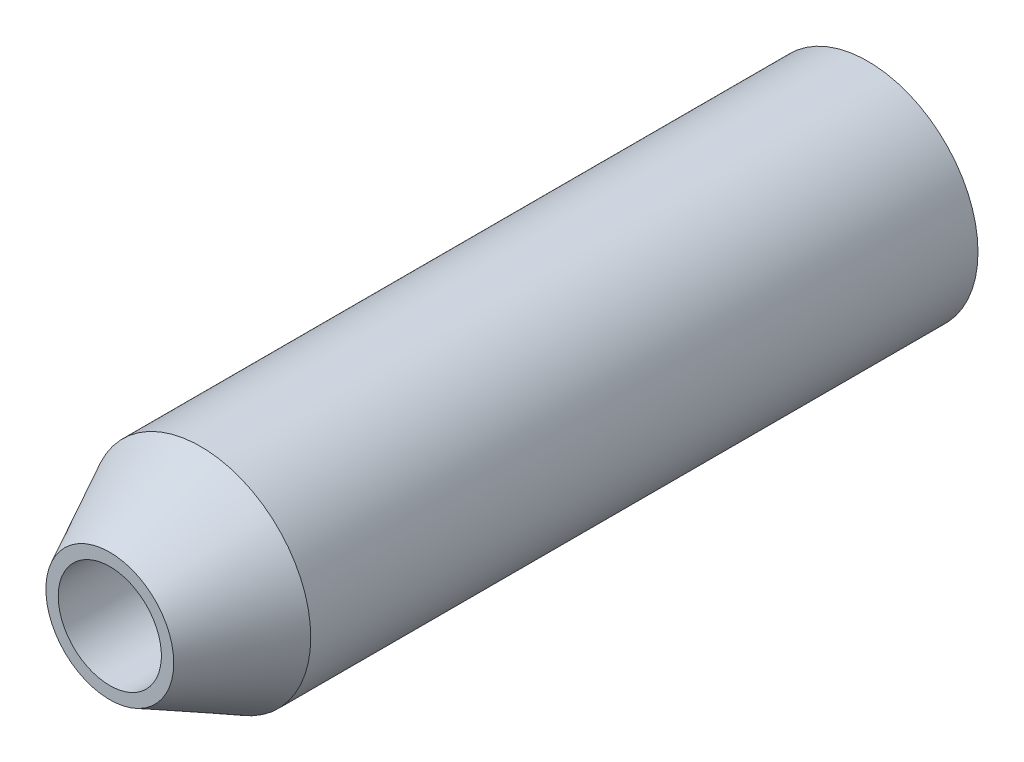
ISO-10303-21;
HEADER;
FILE_DESCRIPTION(('STEP AP214'),'2;1');
FILE_NAME('part.step','',(''),(''),'','','');
FILE_SCHEMA(('AUTOMOTIVE_DESIGN { 1 0 10303 214 1 1 1 1 }'));
ENDSEC;
DATA;
#1=APPLICATION_CONTEXT('core data for automotive mechanical design processes');
#2=APPLICATION_PROTOCOL_DEFINITION('international standard','automotive_design',2000,#1);
#3=PRODUCT_CONTEXT('',#1,'mechanical');
#4=PRODUCT('Part','Part','',(#3));
#5=PRODUCT_RELATED_PRODUCT_CATEGORY('part','',(#4));
#6=PRODUCT_DEFINITION_FORMATION('','',#4);
#7=PRODUCT_DEFINITION_CONTEXT('part definition',#1,'design');
#8=PRODUCT_DEFINITION('design','',#6,#7);
#9=PRODUCT_DEFINITION_SHAPE('','',#8);
#10=(LENGTH_UNIT() NAMED_UNIT(*) SI_UNIT(.MILLI.,.METRE.));
#11=(NAMED_UNIT(*) PLANE_ANGLE_UNIT() SI_UNIT($,.RADIAN.));
#12=(NAMED_UNIT(*) SI_UNIT($,.STERADIAN.) SOLID_ANGLE_UNIT());
#13=UNCERTAINTY_MEASURE_WITH_UNIT(LENGTH_MEASURE(1.E-05),#10,'distance_accuracy_value','');
#14=(GEOMETRIC_REPRESENTATION_CONTEXT(3) GLOBAL_UNCERTAINTY_ASSIGNED_CONTEXT((#13)) GLOBAL_UNIT_ASSIGNED_CONTEXT((#10,
#11,#12)) REPRESENTATION_CONTEXT('',''));
#15=CARTESIAN_POINT('',(0.,0.,0.));
#16=DIRECTION('',(0.,0.,1.));
#17=DIRECTION('',(1.,0.,0.));
#18=AXIS2_PLACEMENT_3D('',#15,#16,#17);
#19=CARTESIAN_POINT('',(0.,0.,10.922));
#20=DIRECTION('',(0.,0.,-1.));
#21=DIRECTION('',(-1.,0.,0.));
#22=AXIS2_PLACEMENT_3D('',#19,#20,#21);
#23=CYLINDRICAL_SURFACE('',#22,3.175);
#24=CARTESIAN_POINT('',(0.,0.,-10.922));
#25=DIRECTION('',(0.,0.,1.));
#26=DIRECTION('',(1.,0.,0.));
#27=AXIS2_PLACEMENT_3D('',#24,#25,#26);
#28=CIRCLE('',#27,3.175);
#29=CARTESIAN_POINT('',(3.175,0.,-10.922));
#30=VERTEX_POINT('',#29);
#31=EDGE_CURVE('E11',#30,#30,#28,.T.);
#32=ORIENTED_EDGE('',*,*,#31,.T.);
#33=EDGE_LOOP('',(#32));
#34=FACE_BOUND('',#33,.T.);
#35=CARTESIAN_POINT('',(0.,0.,8.3058));
#36=DIRECTION('',(0.,0.,1.));
#37=DIRECTION('',(1.,0.,0.));
#38=AXIS2_PLACEMENT_3D('',#35,#36,#37);
#39=CIRCLE('',#38,3.175);
#40=CARTESIAN_POINT('',(3.175,0.,8.3058));
#41=VERTEX_POINT('',#40);
#42=EDGE_CURVE('E71',#41,#41,#39,.T.);
#43=ORIENTED_EDGE('',*,*,#42,.F.);
#44=EDGE_LOOP('',(#43));
#45=FACE_BOUND('',#44,.T.);
#46=ADVANCED_FACE('F38',(#34,#45),#23,.T.);
#47=CARTESIAN_POINT('',(0.,0.,10.922));
#48=DIRECTION('',(0.,0.,1.));
#49=DIRECTION('',(1.,0.,0.));
#50=AXIS2_PLACEMENT_3D('',#47,#48,#49);
#51=PLANE('',#50);
#52=CARTESIAN_POINT('',(0.,0.,10.922));
#53=DIRECTION('',(0.,0.,-1.));
#54=DIRECTION('',(-1.,0.,0.));
#55=AXIS2_PLACEMENT_3D('',#52,#53,#54);
#56=CIRCLE('',#55,1.48589999999999);
#57=CARTESIAN_POINT('',(-1.48589999999999,0.,10.922));
#58=VERTEX_POINT('',#57);
#59=EDGE_CURVE('E45',#58,#58,#56,.T.);
#60=ORIENTED_EDGE('',*,*,#59,.T.);
#61=EDGE_LOOP('',(#60));
#62=FACE_BOUND('',#61,.T.);
#63=CARTESIAN_POINT('',(0.,0.,10.922));
#64=DIRECTION('',(0.,0.,1.));
#65=DIRECTION('',(1.,0.,0.));
#66=AXIS2_PLACEMENT_3D('',#63,#64,#65);
#67=CIRCLE('',#66,1.8419795190327);
#68=CARTESIAN_POINT('',(1.8419795190327,0.,10.922));
#69=VERTEX_POINT('',#68);
#70=EDGE_CURVE('E67',#69,#69,#67,.T.);
#71=ORIENTED_EDGE('',*,*,#70,.T.);
#72=EDGE_LOOP('',(#71));
#73=FACE_BOUND('',#72,.T.);
#74=ADVANCED_FACE('F81',(#62,#73),#51,.T.);
#75=CARTESIAN_POINT('',(0.,0.,-10.922));
#76=DIRECTION('',(0.,0.,1.));
#77=DIRECTION('',(1.,0.,0.));
#78=AXIS2_PLACEMENT_3D('',#75,#76,#77);
#79=PLANE('',#78);
#80=CARTESIAN_POINT('',(0.,0.,-10.922));
#81=DIRECTION('',(0.,0.,-1.));
#82=DIRECTION('',(-1.,0.,0.));
#83=AXIS2_PLACEMENT_3D('',#80,#81,#82);
#84=CIRCLE('',#83,2.34949999999999);
#85=CARTESIAN_POINT('',(-2.34949999999999,0.,-10.922));
#86=VERTEX_POINT('',#85);
#87=EDGE_CURVE('E63',#86,#86,#84,.T.);
#88=ORIENTED_EDGE('',*,*,#87,.F.);
#89=EDGE_LOOP('',(#88));
#90=FACE_BOUND('',#89,.T.);
#91=ORIENTED_EDGE('',*,*,#31,.F.);
#92=EDGE_LOOP('',(#91));
#93=FACE_BOUND('',#92,.T.);
#94=ADVANCED_FACE('F85',(#90,#93),#79,.F.);
#95=CARTESIAN_POINT('',(0.,0.,-10.922));
#96=DIRECTION('',(0.,0.,-1.));
#97=DIRECTION('',(-1.,0.,0.));
#98=AXIS2_PLACEMENT_3D('',#95,#96,#97);
#99=CYLINDRICAL_SURFACE('',#98,1.4859);
#100=ORIENTED_EDGE('',*,*,#59,.F.);
#101=EDGE_LOOP('',(#100));
#102=FACE_BOUND('',#101,.T.);
#103=CARTESIAN_POINT('',(0.,0.,5.715));
#104=DIRECTION('',(0.,0.,-1.));
#105=DIRECTION('',(-1.,0.,0.));
#106=AXIS2_PLACEMENT_3D('',#103,#104,#105);
#107=CIRCLE('',#106,1.4859);
#108=CARTESIAN_POINT('',(-1.4859,0.,5.715));
#109=VERTEX_POINT('',#108);
#110=EDGE_CURVE('E51',#109,#109,#107,.T.);
#111=ORIENTED_EDGE('',*,*,#110,.T.);
#112=EDGE_LOOP('',(#111));
#113=FACE_BOUND('',#112,.T.);
#114=ADVANCED_FACE('F90',(#102,#113),#99,.F.);
#115=CARTESIAN_POINT('',(1.4859,0.,5.715));
#116=DIRECTION('',(0.,0.,1.));
#117=DIRECTION('',(1.,0.,0.));
#118=AXIS2_PLACEMENT_3D('',#115,#116,#117);
#119=PLANE('',#118);
#120=ORIENTED_EDGE('',*,*,#110,.F.);
#121=EDGE_LOOP('',(#120));
#122=FACE_BOUND('',#121,.T.);
#123=CARTESIAN_POINT('',(0.,0.,5.715));
#124=DIRECTION('',(0.,0.,-1.));
#125=DIRECTION('',(-1.,0.,0.));
#126=AXIS2_PLACEMENT_3D('',#123,#124,#125);
#127=CIRCLE('',#126,2.3495);
#128=CARTESIAN_POINT('',(-2.3495,0.,5.715));
#129=VERTEX_POINT('',#128);
#130=EDGE_CURVE('E57',#129,#129,#127,.T.);
#131=ORIENTED_EDGE('',*,*,#130,.T.);
#132=EDGE_LOOP('',(#131));
#133=FACE_BOUND('',#132,.T.);
#134=ADVANCED_FACE('F96',(#122,#133),#119,.F.);
#135=CARTESIAN_POINT('',(0.,0.,-10.922));
#136=DIRECTION('',(0.,0.,-1.));
#137=DIRECTION('',(-1.,0.,0.));
#138=AXIS2_PLACEMENT_3D('',#135,#136,#137);
#139=CYLINDRICAL_SURFACE('',#138,2.3495);
#140=ORIENTED_EDGE('',*,*,#130,.F.);
#141=EDGE_LOOP('',(#140));
#142=FACE_BOUND('',#141,.T.);
#143=ORIENTED_EDGE('',*,*,#87,.T.);
#144=EDGE_LOOP('',(#143));
#145=FACE_BOUND('',#144,.T.);
#146=ADVANCED_FACE('F100',(#142,#145),#139,.F.);
#147=CARTESIAN_POINT('',(0.,0.,10.922));
#148=DIRECTION('',(0.,0.,-1.));
#149=DIRECTION('',(-1.,0.,0.));
#150=AXIS2_PLACEMENT_3D('',#147,#148,#149);
#151=CONICAL_SURFACE('',#150,1.8419795190327,0.471238898038463);
#152=ORIENTED_EDGE('',*,*,#42,.T.);
#153=EDGE_LOOP('',(#152));
#154=FACE_BOUND('',#153,.T.);
#155=ORIENTED_EDGE('',*,*,#70,.F.);
#156=EDGE_LOOP('',(#155));
#157=FACE_BOUND('',#156,.T.);
#158=ADVANCED_FACE('F77',(#154,#157),#151,.T.);
#159=CLOSED_SHELL('',(#46,#74,#94,#114,#134,#146,#158));
#160=MANIFOLD_SOLID_BREP('B2',#159);
#161=ADVANCED_BREP_SHAPE_REPRESENTATION('',(#18,#160),#14);
#162=SHAPE_DEFINITION_REPRESENTATION(#9,#161);
ENDSEC;
END-ISO-10303-21;
